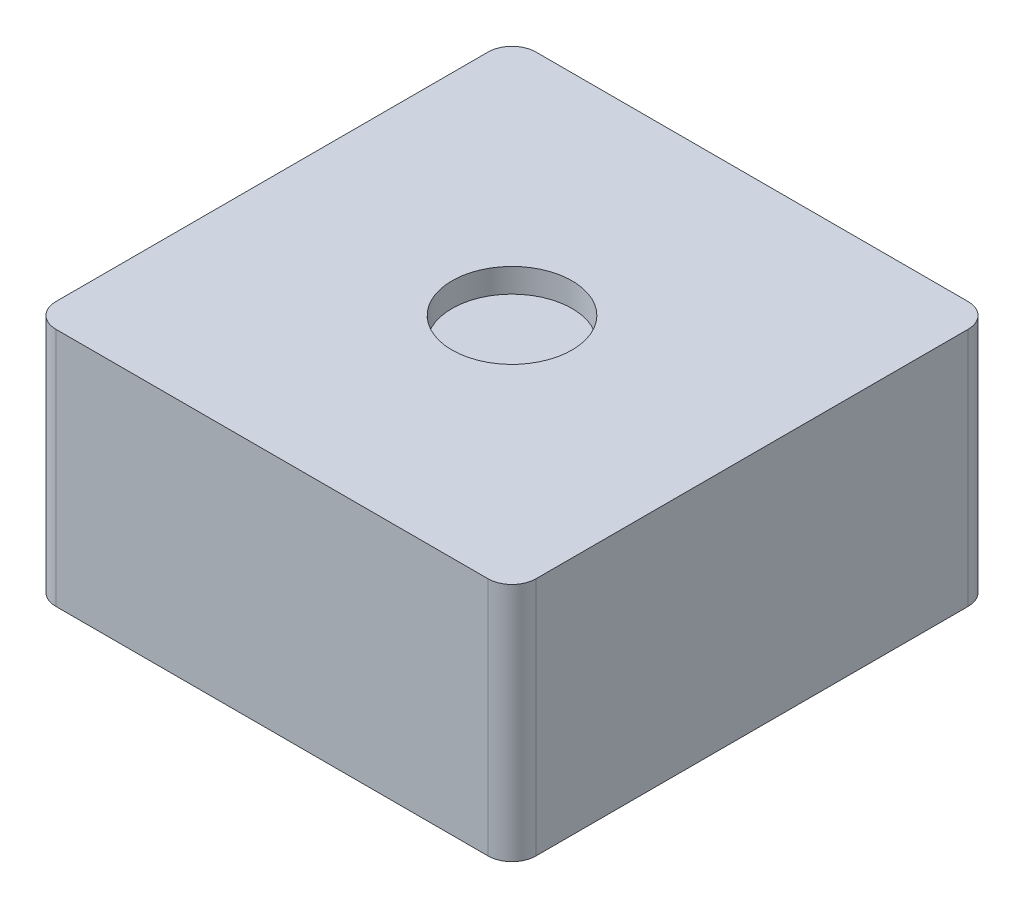
ISO-10303-21;
HEADER;
FILE_DESCRIPTION(('STEP AP214'),'2;1');
FILE_NAME('part.step','',(''),(''),'','','');
FILE_SCHEMA(('AUTOMOTIVE_DESIGN { 1 0 10303 214 1 1 1 1 }'));
ENDSEC;
DATA;
#1=APPLICATION_CONTEXT('core data for automotive mechanical design processes');
#2=APPLICATION_PROTOCOL_DEFINITION('international standard','automotive_design',2000,#1);
#3=PRODUCT_CONTEXT('',#1,'mechanical');
#4=PRODUCT('Part','Part','',(#3));
#5=PRODUCT_RELATED_PRODUCT_CATEGORY('part','',(#4));
#6=PRODUCT_DEFINITION_FORMATION('','',#4);
#7=PRODUCT_DEFINITION_CONTEXT('part definition',#1,'design');
#8=PRODUCT_DEFINITION('design','',#6,#7);
#9=PRODUCT_DEFINITION_SHAPE('','',#8);
#10=(LENGTH_UNIT() NAMED_UNIT(*) SI_UNIT(.MILLI.,.METRE.));
#11=(NAMED_UNIT(*) PLANE_ANGLE_UNIT() SI_UNIT($,.RADIAN.));
#12=(NAMED_UNIT(*) SI_UNIT($,.STERADIAN.) SOLID_ANGLE_UNIT());
#13=UNCERTAINTY_MEASURE_WITH_UNIT(LENGTH_MEASURE(1.E-05),#10,'distance_accuracy_value','');
#14=(GEOMETRIC_REPRESENTATION_CONTEXT(3) GLOBAL_UNCERTAINTY_ASSIGNED_CONTEXT((#13)) GLOBAL_UNIT_ASSIGNED_CONTEXT((#10,
#11,#12)) REPRESENTATION_CONTEXT('',''));
#15=CARTESIAN_POINT('',(0.,0.,0.));
#16=DIRECTION('',(0.,0.,1.));
#17=DIRECTION('',(1.,0.,0.));
#18=AXIS2_PLACEMENT_3D('',#15,#16,#17);
#19=CARTESIAN_POINT('',(-1.52380952380952,2.,-2.04761904761905));
#20=DIRECTION('',(1.,0.,0.));
#21=DIRECTION('',(0.,0.,-1.));
#22=AXIS2_PLACEMENT_3D('',#19,#20,#21);
#23=PLANE('',#22);
#24=DIRECTION('',(0.,0.,1.));
#25=VECTOR('',#24,1.);
#26=CARTESIAN_POINT('',(-1.52380952380952,2.,-2.04761904761905));
#27=LINE('',#26,#25);
#28=CARTESIAN_POINT('',(-1.52380952380952,2.,-1.84761904761905));
#29=VERTEX_POINT('',#28);
#30=CARTESIAN_POINT('',(-1.52380952380952,2.,1.75238095238095));
#31=VERTEX_POINT('',#30);
#32=EDGE_CURVE('E119',#29,#31,#27,.T.);
#33=ORIENTED_EDGE('',*,*,#32,.F.);
#34=DIRECTION('',(0.,-1.,0.));
#35=VECTOR('',#34,1.);
#36=CARTESIAN_POINT('',(-1.52380952380952,2.,-1.84761904761905));
#37=LINE('',#36,#35);
#38=CARTESIAN_POINT('',(-1.52380952380952,0.,-1.84761904761905));
#39=VERTEX_POINT('',#38);
#40=EDGE_CURVE('E104',#29,#39,#37,.T.);
#41=ORIENTED_EDGE('',*,*,#40,.T.);
#42=DIRECTION('',(0.,0.,1.));
#43=VECTOR('',#42,1.);
#44=CARTESIAN_POINT('',(-1.52380952380952,0.,-2.04761904761905));
#45=LINE('',#44,#43);
#46=CARTESIAN_POINT('',(-1.52380952380952,0.,1.75238095238095));
#47=VERTEX_POINT('',#46);
#48=EDGE_CURVE('E116',#39,#47,#45,.T.);
#49=ORIENTED_EDGE('',*,*,#48,.T.);
#50=DIRECTION('',(0.,-1.,0.));
#51=VECTOR('',#50,1.);
#52=CARTESIAN_POINT('',(-1.52380952380952,2.,1.75238095238095));
#53=LINE('',#52,#51);
#54=EDGE_CURVE('E121',#47,#31,#53,.F.);
#55=ORIENTED_EDGE('',*,*,#54,.T.);
#56=EDGE_LOOP('',(#33,#41,#49,#55));
#57=FACE_BOUND('',#56,.T.);
#58=ADVANCED_FACE('F35',(#57),#23,.F.);
#59=CARTESIAN_POINT('',(-1.52380952380952,2.,1.95238095238095));
#60=DIRECTION('',(0.,0.,-1.));
#61=DIRECTION('',(-1.,0.,0.));
#62=AXIS2_PLACEMENT_3D('',#59,#60,#61);
#63=PLANE('',#62);
#64=DIRECTION('',(1.,0.,0.));
#65=VECTOR('',#64,1.);
#66=CARTESIAN_POINT('',(-1.52380952380952,2.,1.95238095238095));
#67=LINE('',#66,#65);
#68=CARTESIAN_POINT('',(-1.32380952380952,2.,1.95238095238095));
#69=VERTEX_POINT('',#68);
#70=CARTESIAN_POINT('',(2.27619047619048,2.,1.95238095238095));
#71=VERTEX_POINT('',#70);
#72=EDGE_CURVE('E174',#69,#71,#67,.T.);
#73=ORIENTED_EDGE('',*,*,#72,.F.);
#74=DIRECTION('',(0.,-1.,0.));
#75=VECTOR('',#74,1.);
#76=CARTESIAN_POINT('',(-1.32380952380952,2.,1.95238095238095));
#77=LINE('',#76,#75);
#78=CARTESIAN_POINT('',(-1.32380952380952,0.,1.95238095238095));
#79=VERTEX_POINT('',#78);
#80=EDGE_CURVE('E158',#69,#79,#77,.T.);
#81=ORIENTED_EDGE('',*,*,#80,.T.);
#82=DIRECTION('',(1.,0.,0.));
#83=VECTOR('',#82,1.);
#84=CARTESIAN_POINT('',(-1.52380952380952,0.,1.95238095238095));
#85=LINE('',#84,#83);
#86=CARTESIAN_POINT('',(2.27619047619048,0.,1.95238095238095));
#87=VERTEX_POINT('',#86);
#88=EDGE_CURVE('E125',#79,#87,#85,.T.);
#89=ORIENTED_EDGE('',*,*,#88,.T.);
#90=DIRECTION('',(0.,-1.,0.));
#91=VECTOR('',#90,1.);
#92=CARTESIAN_POINT('',(2.27619047619048,2.,1.95238095238095));
#93=LINE('',#92,#91);
#94=EDGE_CURVE('E156',#87,#71,#93,.F.);
#95=ORIENTED_EDGE('',*,*,#94,.T.);
#96=EDGE_LOOP('',(#73,#81,#89,#95));
#97=FACE_BOUND('',#96,.T.);
#98=ADVANCED_FACE('F194',(#97),#63,.F.);
#99=CARTESIAN_POINT('',(2.47619047619047,2.,-2.04761904761905));
#100=DIRECTION('',(-1.,0.,0.));
#101=DIRECTION('',(0.,0.,1.));
#102=AXIS2_PLACEMENT_3D('',#99,#100,#101);
#103=PLANE('',#102);
#104=DIRECTION('',(0.,0.,-1.));
#105=VECTOR('',#104,1.);
#106=CARTESIAN_POINT('',(2.47619047619047,0.,-2.04761904761905));
#107=LINE('',#106,#105);
#108=CARTESIAN_POINT('',(2.47619047619047,0.,1.75238095238095));
#109=VERTEX_POINT('',#108);
#110=CARTESIAN_POINT('',(2.47619047619047,0.,-1.84761904761905));
#111=VERTEX_POINT('',#110);
#112=EDGE_CURVE('E129',#109,#111,#107,.T.);
#113=ORIENTED_EDGE('',*,*,#112,.T.);
#114=DIRECTION('',(0.,-1.,0.));
#115=VECTOR('',#114,1.);
#116=CARTESIAN_POINT('',(2.47619047619047,2.,-1.84761904761905));
#117=LINE('',#116,#115);
#118=CARTESIAN_POINT('',(2.47619047619047,2.,-1.84761904761905));
#119=VERTEX_POINT('',#118);
#120=EDGE_CURVE('E11',#111,#119,#117,.F.);
#121=ORIENTED_EDGE('',*,*,#120,.T.);
#122=DIRECTION('',(0.,0.,-1.));
#123=VECTOR('',#122,1.);
#124=CARTESIAN_POINT('',(2.47619047619047,2.,-2.04761904761905));
#125=LINE('',#124,#123);
#126=CARTESIAN_POINT('',(2.47619047619047,2.,1.75238095238095));
#127=VERTEX_POINT('',#126);
#128=EDGE_CURVE('E164',#127,#119,#125,.T.);
#129=ORIENTED_EDGE('',*,*,#128,.F.);
#130=DIRECTION('',(0.,-1.,0.));
#131=VECTOR('',#130,1.);
#132=CARTESIAN_POINT('',(2.47619047619047,2.,1.75238095238095));
#133=LINE('',#132,#131);
#134=EDGE_CURVE('E43',#127,#109,#133,.T.);
#135=ORIENTED_EDGE('',*,*,#134,.T.);
#136=EDGE_LOOP('',(#113,#121,#129,#135));
#137=FACE_BOUND('',#136,.T.);
#138=ADVANCED_FACE('F163',(#137),#103,.F.);
#139=CARTESIAN_POINT('',(-1.52380952380952,2.,-2.04761904761905));
#140=DIRECTION('',(0.,0.,1.));
#141=DIRECTION('',(1.,0.,0.));
#142=AXIS2_PLACEMENT_3D('',#139,#140,#141);
#143=PLANE('',#142);
#144=DIRECTION('',(-1.,0.,0.));
#145=VECTOR('',#144,1.);
#146=CARTESIAN_POINT('',(-1.52380952380952,0.,-2.04761904761905));
#147=LINE('',#146,#145);
#148=CARTESIAN_POINT('',(2.27619047619048,0.,-2.04761904761905));
#149=VERTEX_POINT('',#148);
#150=CARTESIAN_POINT('',(-1.32380952380952,0.,-2.04761904761905));
#151=VERTEX_POINT('',#150);
#152=EDGE_CURVE('E139',#149,#151,#147,.T.);
#153=ORIENTED_EDGE('',*,*,#152,.T.);
#154=DIRECTION('',(0.,-1.,0.));
#155=VECTOR('',#154,1.);
#156=CARTESIAN_POINT('',(-1.32380952380952,2.,-2.04761904761905));
#157=LINE('',#156,#155);
#158=CARTESIAN_POINT('',(-1.32380952380952,2.,-2.04761904761905));
#159=VERTEX_POINT('',#158);
#160=EDGE_CURVE('E105',#151,#159,#157,.F.);
#161=ORIENTED_EDGE('',*,*,#160,.T.);
#162=DIRECTION('',(-1.,0.,0.));
#163=VECTOR('',#162,1.);
#164=CARTESIAN_POINT('',(-1.52380952380952,2.,-2.04761904761905));
#165=LINE('',#164,#163);
#166=CARTESIAN_POINT('',(2.27619047619048,2.,-2.04761904761905));
#167=VERTEX_POINT('',#166);
#168=EDGE_CURVE('E135',#167,#159,#165,.T.);
#169=ORIENTED_EDGE('',*,*,#168,.F.);
#170=DIRECTION('',(0.,-1.,0.));
#171=VECTOR('',#170,1.);
#172=CARTESIAN_POINT('',(2.27619047619048,2.,-2.04761904761905));
#173=LINE('',#172,#171);
#174=EDGE_CURVE('E110',#167,#149,#173,.T.);
#175=ORIENTED_EDGE('',*,*,#174,.T.);
#176=EDGE_LOOP('',(#153,#161,#169,#175));
#177=FACE_BOUND('',#176,.T.);
#178=ADVANCED_FACE('F172',(#177),#143,.F.);
#179=CARTESIAN_POINT('',(0.,2.,0.));
#180=DIRECTION('',(0.,1.,0.));
#181=DIRECTION('',(0.,0.,1.));
#182=AXIS2_PLACEMENT_3D('',#179,#180,#181);
#183=PLANE('',#182);
#184=CARTESIAN_POINT('',(0.476190476190475,2.,-0.0476190476190481));
#185=DIRECTION('',(0.,1.,0.));
#186=DIRECTION('',(0.,0.,1.));
#187=AXIS2_PLACEMENT_3D('',#184,#185,#186);
#188=CIRCLE('',#187,0.5);
#189=CARTESIAN_POINT('',(0.476190476190475,2.,0.452380952380952));
#190=VERTEX_POINT('',#189);
#191=EDGE_CURVE('E132',#190,#190,#188,.T.);
#192=ORIENTED_EDGE('',*,*,#191,.F.);
#193=EDGE_LOOP('',(#192));
#194=FACE_BOUND('',#193,.T.);
#195=ORIENTED_EDGE('',*,*,#168,.T.);
#196=CARTESIAN_POINT('',(-1.32380952380952,2.,-1.84761904761905));
#197=DIRECTION('',(0.,1.,0.));
#198=DIRECTION('',(0.,0.,1.));
#199=AXIS2_PLACEMENT_3D('',#196,#197,#198);
#200=CIRCLE('',#199,0.2);
#201=EDGE_CURVE('E154',#159,#29,#200,.T.);
#202=ORIENTED_EDGE('',*,*,#201,.T.);
#203=ORIENTED_EDGE('',*,*,#32,.T.);
#204=CARTESIAN_POINT('',(-1.32380952380952,2.,1.75238095238095));
#205=DIRECTION('',(0.,1.,0.));
#206=DIRECTION('',(0.,0.,1.));
#207=AXIS2_PLACEMENT_3D('',#204,#205,#206);
#208=CIRCLE('',#207,0.2);
#209=EDGE_CURVE('E152',#31,#69,#208,.T.);
#210=ORIENTED_EDGE('',*,*,#209,.T.);
#211=ORIENTED_EDGE('',*,*,#72,.T.);
#212=CARTESIAN_POINT('',(2.27619047619048,2.,1.75238095238095));
#213=DIRECTION('',(0.,1.,0.));
#214=DIRECTION('',(0.,0.,1.));
#215=AXIS2_PLACEMENT_3D('',#212,#213,#214);
#216=CIRCLE('',#215,0.2);
#217=EDGE_CURVE('E55',#71,#127,#216,.T.);
#218=ORIENTED_EDGE('',*,*,#217,.T.);
#219=ORIENTED_EDGE('',*,*,#128,.T.);
#220=CARTESIAN_POINT('',(2.27619047619048,2.,-1.84761904761905));
#221=DIRECTION('',(0.,1.,0.));
#222=DIRECTION('',(0.,0.,1.));
#223=AXIS2_PLACEMENT_3D('',#220,#221,#222);
#224=CIRCLE('',#223,0.2);
#225=EDGE_CURVE('E150',#119,#167,#224,.T.);
#226=ORIENTED_EDGE('',*,*,#225,.T.);
#227=EDGE_LOOP('',(#195,#202,#203,#210,#211,#218,#219,#226));
#228=FACE_BOUND('',#227,.T.);
#229=ADVANCED_FACE('F183',(#194,#228),#183,.T.);
#230=CARTESIAN_POINT('',(0.,0.,0.));
#231=DIRECTION('',(0.,1.,0.));
#232=DIRECTION('',(0.,0.,1.));
#233=AXIS2_PLACEMENT_3D('',#230,#231,#232);
#234=PLANE('',#233);
#235=ORIENTED_EDGE('',*,*,#48,.F.);
#236=CARTESIAN_POINT('',(-1.32380952380952,0.,-1.84761904761905));
#237=DIRECTION('',(0.,1.,0.));
#238=DIRECTION('',(0.,0.,1.));
#239=AXIS2_PLACEMENT_3D('',#236,#237,#238);
#240=CIRCLE('',#239,0.2);
#241=EDGE_CURVE('E100',#39,#151,#240,.F.);
#242=ORIENTED_EDGE('',*,*,#241,.T.);
#243=ORIENTED_EDGE('',*,*,#152,.F.);
#244=CARTESIAN_POINT('',(2.27619047619048,0.,-1.84761904761905));
#245=DIRECTION('',(0.,1.,0.));
#246=DIRECTION('',(0.,0.,1.));
#247=AXIS2_PLACEMENT_3D('',#244,#245,#246);
#248=CIRCLE('',#247,0.2);
#249=EDGE_CURVE('E143',#149,#111,#248,.F.);
#250=ORIENTED_EDGE('',*,*,#249,.T.);
#251=ORIENTED_EDGE('',*,*,#112,.F.);
#252=CARTESIAN_POINT('',(2.27619047619048,0.,1.75238095238095));
#253=DIRECTION('',(0.,1.,0.));
#254=DIRECTION('',(0.,0.,1.));
#255=AXIS2_PLACEMENT_3D('',#252,#253,#254);
#256=CIRCLE('',#255,0.2);
#257=EDGE_CURVE('E120',#109,#87,#256,.F.);
#258=ORIENTED_EDGE('',*,*,#257,.T.);
#259=ORIENTED_EDGE('',*,*,#88,.F.);
#260=CARTESIAN_POINT('',(-1.32380952380952,0.,1.75238095238095));
#261=DIRECTION('',(0.,1.,0.));
#262=DIRECTION('',(0.,0.,1.));
#263=AXIS2_PLACEMENT_3D('',#260,#261,#262);
#264=CIRCLE('',#263,0.2);
#265=EDGE_CURVE('E111',#79,#47,#264,.F.);
#266=ORIENTED_EDGE('',*,*,#265,.T.);
#267=EDGE_LOOP('',(#235,#242,#243,#250,#251,#258,#259,#266));
#268=FACE_BOUND('',#267,.T.);
#269=ADVANCED_FACE('F123',(#268),#234,.F.);
#270=CARTESIAN_POINT('',(0.476190476190475,1.8,-0.0476190476190481));
#271=DIRECTION('',(0.,1.,0.));
#272=DIRECTION('',(0.,0.,1.));
#273=AXIS2_PLACEMENT_3D('',#270,#271,#272);
#274=CYLINDRICAL_SURFACE('',#273,0.5);
#275=CARTESIAN_POINT('',(0.476190476190475,1.8,-0.0476190476190481));
#276=DIRECTION('',(0.,1.,0.));
#277=DIRECTION('',(0.,0.,1.));
#278=AXIS2_PLACEMENT_3D('',#275,#276,#277);
#279=CIRCLE('',#278,0.5);
#280=CARTESIAN_POINT('',(0.476190476190475,1.8,0.452380952380952));
#281=VERTEX_POINT('',#280);
#282=EDGE_CURVE('E126',#281,#281,#279,.T.);
#283=ORIENTED_EDGE('',*,*,#282,.F.);
#284=EDGE_LOOP('',(#283));
#285=FACE_BOUND('',#284,.T.);
#286=ORIENTED_EDGE('',*,*,#191,.T.);
#287=EDGE_LOOP('',(#286));
#288=FACE_BOUND('',#287,.T.);
#289=ADVANCED_FACE('F181',(#285,#288),#274,.F.);
#290=CARTESIAN_POINT('',(0.476190476190475,1.8,-0.0476190476190481));
#291=DIRECTION('',(0.,1.,0.));
#292=DIRECTION('',(0.,0.,1.));
#293=AXIS2_PLACEMENT_3D('',#290,#291,#292);
#294=PLANE('',#293);
#295=ORIENTED_EDGE('',*,*,#282,.T.);
#296=EDGE_LOOP('',(#295));
#297=FACE_BOUND('',#296,.T.);
#298=ADVANCED_FACE('F206',(#297),#294,.T.);
#299=CARTESIAN_POINT('',(-1.32380952380952,2.,-1.84761904761905));
#300=DIRECTION('',(0.,-1.,0.));
#301=DIRECTION('',(0.,0.,-1.));
#302=AXIS2_PLACEMENT_3D('',#299,#300,#301);
#303=CYLINDRICAL_SURFACE('',#302,0.2);
#304=ORIENTED_EDGE('',*,*,#201,.F.);
#305=ORIENTED_EDGE('',*,*,#160,.F.);
#306=ORIENTED_EDGE('',*,*,#241,.F.);
#307=ORIENTED_EDGE('',*,*,#40,.F.);
#308=EDGE_LOOP('',(#304,#305,#306,#307));
#309=FACE_BOUND('',#308,.T.);
#310=ADVANCED_FACE('F103',(#309),#303,.T.);
#311=CARTESIAN_POINT('',(-1.32380952380952,2.,1.75238095238095));
#312=DIRECTION('',(0.,-1.,0.));
#313=DIRECTION('',(0.,0.,-1.));
#314=AXIS2_PLACEMENT_3D('',#311,#312,#313);
#315=CYLINDRICAL_SURFACE('',#314,0.2);
#316=ORIENTED_EDGE('',*,*,#209,.F.);
#317=ORIENTED_EDGE('',*,*,#54,.F.);
#318=ORIENTED_EDGE('',*,*,#265,.F.);
#319=ORIENTED_EDGE('',*,*,#80,.F.);
#320=EDGE_LOOP('',(#316,#317,#318,#319));
#321=FACE_BOUND('',#320,.T.);
#322=ADVANCED_FACE('F205',(#321),#315,.T.);
#323=CARTESIAN_POINT('',(2.27619047619048,2.,-1.84761904761905));
#324=DIRECTION('',(0.,-1.,0.));
#325=DIRECTION('',(0.,0.,-1.));
#326=AXIS2_PLACEMENT_3D('',#323,#324,#325);
#327=CYLINDRICAL_SURFACE('',#326,0.2);
#328=ORIENTED_EDGE('',*,*,#225,.F.);
#329=ORIENTED_EDGE('',*,*,#120,.F.);
#330=ORIENTED_EDGE('',*,*,#249,.F.);
#331=ORIENTED_EDGE('',*,*,#174,.F.);
#332=EDGE_LOOP('',(#328,#329,#330,#331));
#333=FACE_BOUND('',#332,.T.);
#334=ADVANCED_FACE('F169',(#333),#327,.T.);
#335=CARTESIAN_POINT('',(2.27619047619048,2.,1.75238095238095));
#336=DIRECTION('',(0.,-1.,0.));
#337=DIRECTION('',(0.,0.,-1.));
#338=AXIS2_PLACEMENT_3D('',#335,#336,#337);
#339=CYLINDRICAL_SURFACE('',#338,0.2);
#340=ORIENTED_EDGE('',*,*,#217,.F.);
#341=ORIENTED_EDGE('',*,*,#94,.F.);
#342=ORIENTED_EDGE('',*,*,#257,.F.);
#343=ORIENTED_EDGE('',*,*,#134,.F.);
#344=EDGE_LOOP('',(#340,#341,#342,#343));
#345=FACE_BOUND('',#344,.T.);
#346=ADVANCED_FACE('F37',(#345),#339,.T.);
#347=CLOSED_SHELL('',(#58,#98,#138,#178,#229,#269,#289,#298,#310,#322,#334,#346));
#348=MANIFOLD_SOLID_BREP('B2',#347);
#349=ADVANCED_BREP_SHAPE_REPRESENTATION('',(#18,#348),#14);
#350=SHAPE_DEFINITION_REPRESENTATION(#9,#349);
ENDSEC;
END-ISO-10303-21;
